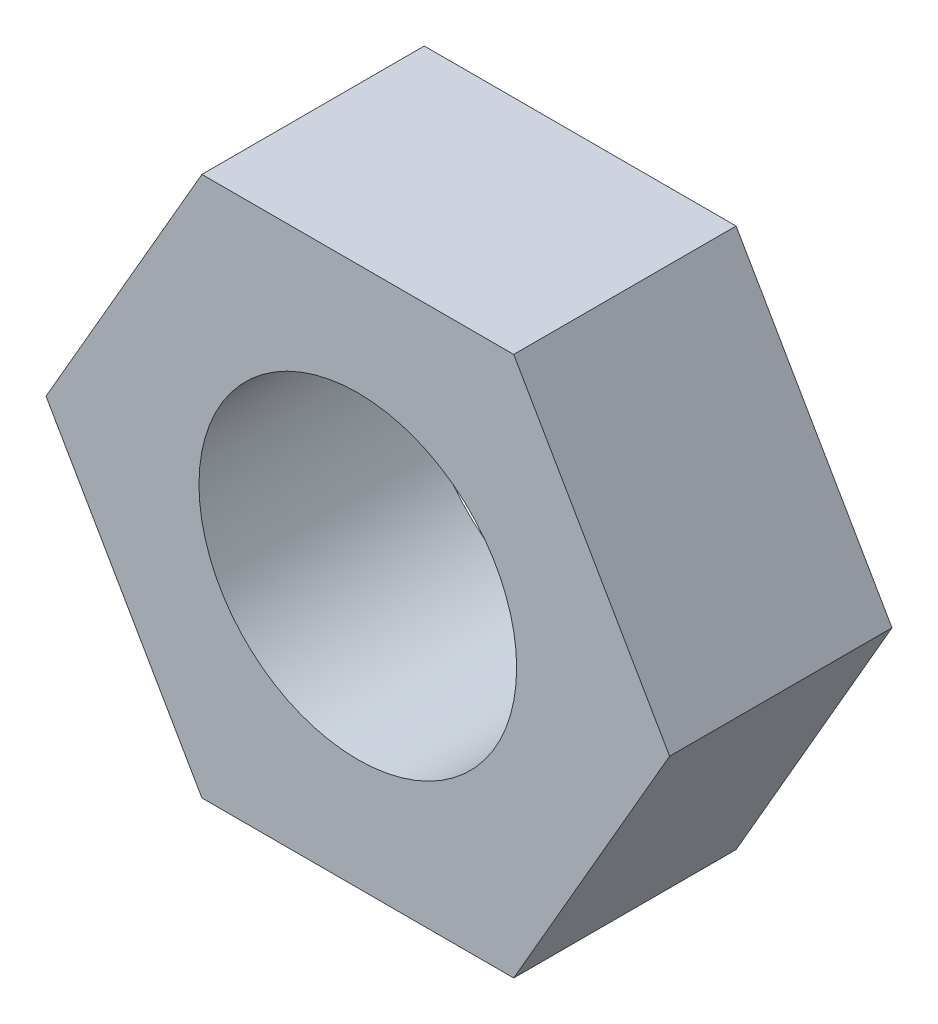
ISO-10303-21;
HEADER;
FILE_DESCRIPTION(('STEP AP214'),'2;1');
FILE_NAME('part.step','',(''),(''),'','','');
FILE_SCHEMA(('AUTOMOTIVE_DESIGN { 1 0 10303 214 1 1 1 1 }'));
ENDSEC;
DATA;
#1=APPLICATION_CONTEXT('core data for automotive mechanical design processes');
#2=APPLICATION_PROTOCOL_DEFINITION('international standard','automotive_design',2000,#1);
#3=PRODUCT_CONTEXT('',#1,'mechanical');
#4=PRODUCT('Part','Part','',(#3));
#5=PRODUCT_RELATED_PRODUCT_CATEGORY('part','',(#4));
#6=PRODUCT_DEFINITION_FORMATION('','',#4);
#7=PRODUCT_DEFINITION_CONTEXT('part definition',#1,'design');
#8=PRODUCT_DEFINITION('design','',#6,#7);
#9=PRODUCT_DEFINITION_SHAPE('','',#8);
#10=(LENGTH_UNIT() NAMED_UNIT(*) SI_UNIT(.MILLI.,.METRE.));
#11=(NAMED_UNIT(*) PLANE_ANGLE_UNIT() SI_UNIT($,.RADIAN.));
#12=(NAMED_UNIT(*) SI_UNIT($,.STERADIAN.) SOLID_ANGLE_UNIT());
#13=UNCERTAINTY_MEASURE_WITH_UNIT(LENGTH_MEASURE(1.E-05),#10,'distance_accuracy_value','');
#14=(GEOMETRIC_REPRESENTATION_CONTEXT(3) GLOBAL_UNCERTAINTY_ASSIGNED_CONTEXT((#13)) GLOBAL_UNIT_ASSIGNED_CONTEXT((#10,
#11,#12)) REPRESENTATION_CONTEXT('',''));
#15=CARTESIAN_POINT('',(0.,0.,0.));
#16=DIRECTION('',(0.,0.,1.));
#17=DIRECTION('',(1.,0.,0.));
#18=AXIS2_PLACEMENT_3D('',#15,#16,#17);
#19=CARTESIAN_POINT('',(0.,0.,7.));
#20=DIRECTION('',(0.,0.,1.));
#21=DIRECTION('',(1.,0.,0.));
#22=AXIS2_PLACEMENT_3D('',#19,#20,#21);
#23=PLANE('',#22);
#24=DIRECTION('',(0.499999999999995,0.866025403784441,0.));
#25=VECTOR('',#24,1.);
#26=CARTESIAN_POINT('',(4.90747728811192,-8.49999999999995,7.));
#27=LINE('',#26,#25);
#28=CARTESIAN_POINT('',(4.90747728811192,-8.49999999999995,7.));
#29=VERTEX_POINT('',#28);
#30=CARTESIAN_POINT('',(9.81495457622365,0.,7.));
#31=VERTEX_POINT('',#30);
#32=EDGE_CURVE('E133',#29,#31,#27,.T.);
#33=ORIENTED_EDGE('',*,*,#32,.T.);
#34=DIRECTION('',(-0.500000000000001,0.866025403784438,0.));
#35=VECTOR('',#34,1.);
#36=CARTESIAN_POINT('',(9.81495457622365,0.,7.));
#37=LINE('',#36,#35);
#38=CARTESIAN_POINT('',(4.9074772881118,8.50000000000002,7.));
#39=VERTEX_POINT('',#38);
#40=EDGE_CURVE('E91',#31,#39,#37,.T.);
#41=ORIENTED_EDGE('',*,*,#40,.T.);
#42=DIRECTION('',(-1.,0.,0.));
#43=VECTOR('',#42,1.);
#44=CARTESIAN_POINT('',(4.9074772881118,8.50000000000002,7.));
#45=LINE('',#44,#43);
#46=CARTESIAN_POINT('',(-4.90747728811186,8.49999999999999,7.));
#47=VERTEX_POINT('',#46);
#48=EDGE_CURVE('E104',#39,#47,#45,.T.);
#49=ORIENTED_EDGE('',*,*,#48,.T.);
#50=DIRECTION('',(-0.499999999999995,-0.866025403784442,0.));
#51=VECTOR('',#50,1.);
#52=CARTESIAN_POINT('',(-4.90747728811186,8.49999999999999,7.));
#53=LINE('',#52,#51);
#54=CARTESIAN_POINT('',(-9.81495457622364,0.,7.));
#55=VERTEX_POINT('',#54);
#56=EDGE_CURVE('E98',#47,#55,#53,.T.);
#57=ORIENTED_EDGE('',*,*,#56,.T.);
#58=DIRECTION('',(0.500000000000007,-0.866025403784435,0.));
#59=VECTOR('',#58,1.);
#60=CARTESIAN_POINT('',(-9.81495457622364,0.,7.));
#61=LINE('',#60,#59);
#62=CARTESIAN_POINT('',(-4.90747728811174,-8.50000000000005,7.));
#63=VERTEX_POINT('',#62);
#64=EDGE_CURVE('E102',#55,#63,#61,.T.);
#65=ORIENTED_EDGE('',*,*,#64,.T.);
#66=DIRECTION('',(1.,0.,0.));
#67=VECTOR('',#66,1.);
#68=CARTESIAN_POINT('',(-4.90747728811174,-8.50000000000005,7.));
#69=LINE('',#68,#67);
#70=EDGE_CURVE('E54',#63,#29,#69,.T.);
#71=ORIENTED_EDGE('',*,*,#70,.T.);
#72=EDGE_LOOP('',(#33,#41,#49,#57,#65,#71));
#73=FACE_BOUND('',#72,.T.);
#74=CARTESIAN_POINT('',(0.,0.,7.));
#75=DIRECTION('',(0.,0.,1.));
#76=DIRECTION('',(1.,0.,0.));
#77=AXIS2_PLACEMENT_3D('',#74,#75,#76);
#78=CIRCLE('',#77,5.);
#79=CARTESIAN_POINT('',(5.,0.,7.));
#80=VERTEX_POINT('',#79);
#81=EDGE_CURVE('E126',#80,#80,#78,.T.);
#82=ORIENTED_EDGE('',*,*,#81,.F.);
#83=EDGE_LOOP('',(#82));
#84=FACE_BOUND('',#83,.T.);
#85=ADVANCED_FACE('F37',(#73,#84),#23,.T.);
#86=CARTESIAN_POINT('',(0.,0.,0.));
#87=DIRECTION('',(0.,0.,1.));
#88=DIRECTION('',(1.,0.,0.));
#89=AXIS2_PLACEMENT_3D('',#86,#87,#88);
#90=PLANE('',#89);
#91=DIRECTION('',(0.499999999999995,0.866025403784441,0.));
#92=VECTOR('',#91,1.);
#93=CARTESIAN_POINT('',(4.90747728811192,-8.49999999999995,0.));
#94=LINE('',#93,#92);
#95=CARTESIAN_POINT('',(4.90747728811192,-8.49999999999995,0.));
#96=VERTEX_POINT('',#95);
#97=CARTESIAN_POINT('',(9.81495457622365,0.,0.));
#98=VERTEX_POINT('',#97);
#99=EDGE_CURVE('E122',#96,#98,#94,.T.);
#100=ORIENTED_EDGE('',*,*,#99,.F.);
#101=DIRECTION('',(1.,0.,0.));
#102=VECTOR('',#101,1.);
#103=CARTESIAN_POINT('',(-4.90747728811174,-8.50000000000005,0.));
#104=LINE('',#103,#102);
#105=CARTESIAN_POINT('',(-4.90747728811174,-8.50000000000005,0.));
#106=VERTEX_POINT('',#105);
#107=EDGE_CURVE('E83',#106,#96,#104,.T.);
#108=ORIENTED_EDGE('',*,*,#107,.F.);
#109=DIRECTION('',(0.500000000000007,-0.866025403784435,0.));
#110=VECTOR('',#109,1.);
#111=CARTESIAN_POINT('',(-9.81495457622364,0.,0.));
#112=LINE('',#111,#110);
#113=CARTESIAN_POINT('',(-9.81495457622364,0.,0.));
#114=VERTEX_POINT('',#113);
#115=EDGE_CURVE('E77',#114,#106,#112,.T.);
#116=ORIENTED_EDGE('',*,*,#115,.F.);
#117=DIRECTION('',(-0.499999999999995,-0.866025403784442,0.));
#118=VECTOR('',#117,1.);
#119=CARTESIAN_POINT('',(-4.90747728811186,8.49999999999999,0.));
#120=LINE('',#119,#118);
#121=CARTESIAN_POINT('',(-4.90747728811186,8.49999999999999,0.));
#122=VERTEX_POINT('',#121);
#123=EDGE_CURVE('E112',#122,#114,#120,.T.);
#124=ORIENTED_EDGE('',*,*,#123,.F.);
#125=DIRECTION('',(-1.,0.,0.));
#126=VECTOR('',#125,1.);
#127=CARTESIAN_POINT('',(4.9074772881118,8.50000000000002,0.));
#128=LINE('',#127,#126);
#129=CARTESIAN_POINT('',(4.9074772881118,8.50000000000002,0.));
#130=VERTEX_POINT('',#129);
#131=EDGE_CURVE('E128',#130,#122,#128,.T.);
#132=ORIENTED_EDGE('',*,*,#131,.F.);
#133=DIRECTION('',(-0.500000000000001,0.866025403784438,0.));
#134=VECTOR('',#133,1.);
#135=CARTESIAN_POINT('',(9.81495457622365,0.,0.));
#136=LINE('',#135,#134);
#137=EDGE_CURVE('E125',#98,#130,#136,.T.);
#138=ORIENTED_EDGE('',*,*,#137,.F.);
#139=EDGE_LOOP('',(#100,#108,#116,#124,#132,#138));
#140=FACE_BOUND('',#139,.T.);
#141=CARTESIAN_POINT('',(0.,0.,0.));
#142=DIRECTION('',(0.,0.,1.));
#143=DIRECTION('',(1.,0.,0.));
#144=AXIS2_PLACEMENT_3D('',#141,#142,#143);
#145=CIRCLE('',#144,5.);
#146=CARTESIAN_POINT('',(5.,0.,0.));
#147=VERTEX_POINT('',#146);
#148=EDGE_CURVE('E244',#147,#147,#145,.T.);
#149=ORIENTED_EDGE('',*,*,#148,.T.);
#150=EDGE_LOOP('',(#149));
#151=FACE_BOUND('',#150,.T.);
#152=ADVANCED_FACE('F142',(#140,#151),#90,.F.);
#153=CARTESIAN_POINT('',(4.90747728811192,-8.49999999999995,7.));
#154=DIRECTION('',(-0.866025403784441,0.499999999999995,0.));
#155=DIRECTION('',(-0.499999999999995,-0.866025403784441,0.));
#156=AXIS2_PLACEMENT_3D('',#153,#154,#155);
#157=PLANE('',#156);
#158=ORIENTED_EDGE('',*,*,#99,.T.);
#159=DIRECTION('',(0.,0.,-1.));
#160=VECTOR('',#159,1.);
#161=CARTESIAN_POINT('',(9.81495457622365,0.,7.));
#162=LINE('',#161,#160);
#163=EDGE_CURVE('E11',#31,#98,#162,.T.);
#164=ORIENTED_EDGE('',*,*,#163,.F.);
#165=ORIENTED_EDGE('',*,*,#32,.F.);
#166=DIRECTION('',(0.,0.,-1.));
#167=VECTOR('',#166,1.);
#168=CARTESIAN_POINT('',(4.90747728811192,-8.49999999999995,7.));
#169=LINE('',#168,#167);
#170=EDGE_CURVE('E118',#29,#96,#169,.T.);
#171=ORIENTED_EDGE('',*,*,#170,.T.);
#172=EDGE_LOOP('',(#158,#164,#165,#171));
#173=FACE_BOUND('',#172,.T.);
#174=ADVANCED_FACE('F39',(#173),#157,.F.);
#175=CARTESIAN_POINT('',(9.81495457622365,0.,7.));
#176=DIRECTION('',(-0.866025403784438,-0.500000000000001,0.));
#177=DIRECTION('',(0.500000000000001,-0.866025403784438,0.));
#178=AXIS2_PLACEMENT_3D('',#175,#176,#177);
#179=PLANE('',#178);
#180=ORIENTED_EDGE('',*,*,#137,.T.);
#181=DIRECTION('',(0.,0.,-1.));
#182=VECTOR('',#181,1.);
#183=CARTESIAN_POINT('',(4.9074772881118,8.50000000000002,7.));
#184=LINE('',#183,#182);
#185=EDGE_CURVE('E46',#39,#130,#184,.T.);
#186=ORIENTED_EDGE('',*,*,#185,.F.);
#187=ORIENTED_EDGE('',*,*,#40,.F.);
#188=ORIENTED_EDGE('',*,*,#163,.T.);
#189=EDGE_LOOP('',(#180,#186,#187,#188));
#190=FACE_BOUND('',#189,.T.);
#191=ADVANCED_FACE('F167',(#190),#179,.F.);
#192=CARTESIAN_POINT('',(4.9074772881118,8.50000000000002,7.));
#193=DIRECTION('',(0.,-1.,0.));
#194=DIRECTION('',(1.,0.,0.));
#195=AXIS2_PLACEMENT_3D('',#192,#193,#194);
#196=PLANE('',#195);
#197=ORIENTED_EDGE('',*,*,#131,.T.);
#198=DIRECTION('',(0.,0.,-1.));
#199=VECTOR('',#198,1.);
#200=CARTESIAN_POINT('',(-4.90747728811186,8.49999999999999,7.));
#201=LINE('',#200,#199);
#202=EDGE_CURVE('E113',#47,#122,#201,.T.);
#203=ORIENTED_EDGE('',*,*,#202,.F.);
#204=ORIENTED_EDGE('',*,*,#48,.F.);
#205=ORIENTED_EDGE('',*,*,#185,.T.);
#206=EDGE_LOOP('',(#197,#203,#204,#205));
#207=FACE_BOUND('',#206,.T.);
#208=ADVANCED_FACE('F139',(#207),#196,.F.);
#209=CARTESIAN_POINT('',(-4.90747728811186,8.49999999999999,7.));
#210=DIRECTION('',(0.866025403784442,-0.499999999999995,0.));
#211=DIRECTION('',(0.499999999999995,0.866025403784442,0.));
#212=AXIS2_PLACEMENT_3D('',#209,#210,#211);
#213=PLANE('',#212);
#214=ORIENTED_EDGE('',*,*,#123,.T.);
#215=DIRECTION('',(0.,0.,-1.));
#216=VECTOR('',#215,1.);
#217=CARTESIAN_POINT('',(-9.81495457622364,0.,7.));
#218=LINE('',#217,#216);
#219=EDGE_CURVE('E109',#55,#114,#218,.T.);
#220=ORIENTED_EDGE('',*,*,#219,.F.);
#221=ORIENTED_EDGE('',*,*,#56,.F.);
#222=ORIENTED_EDGE('',*,*,#202,.T.);
#223=EDGE_LOOP('',(#214,#220,#221,#222));
#224=FACE_BOUND('',#223,.T.);
#225=ADVANCED_FACE('F110',(#224),#213,.F.);
#226=CARTESIAN_POINT('',(-9.81495457622364,0.,7.));
#227=DIRECTION('',(0.866025403784435,0.500000000000007,0.));
#228=DIRECTION('',(-0.500000000000007,0.866025403784435,0.));
#229=AXIS2_PLACEMENT_3D('',#226,#227,#228);
#230=PLANE('',#229);
#231=ORIENTED_EDGE('',*,*,#115,.T.);
#232=DIRECTION('',(0.,0.,-1.));
#233=VECTOR('',#232,1.);
#234=CARTESIAN_POINT('',(-4.90747728811174,-8.50000000000005,7.));
#235=LINE('',#234,#233);
#236=EDGE_CURVE('E114',#63,#106,#235,.T.);
#237=ORIENTED_EDGE('',*,*,#236,.F.);
#238=ORIENTED_EDGE('',*,*,#64,.F.);
#239=ORIENTED_EDGE('',*,*,#219,.T.);
#240=EDGE_LOOP('',(#231,#237,#238,#239));
#241=FACE_BOUND('',#240,.T.);
#242=ADVANCED_FACE('F116',(#241),#230,.F.);
#243=CARTESIAN_POINT('',(-4.90747728811174,-8.50000000000005,7.));
#244=DIRECTION('',(0.,1.,0.));
#245=DIRECTION('',(-1.,0.,0.));
#246=AXIS2_PLACEMENT_3D('',#243,#244,#245);
#247=PLANE('',#246);
#248=ORIENTED_EDGE('',*,*,#107,.T.);
#249=ORIENTED_EDGE('',*,*,#170,.F.);
#250=ORIENTED_EDGE('',*,*,#70,.F.);
#251=ORIENTED_EDGE('',*,*,#236,.T.);
#252=EDGE_LOOP('',(#248,#249,#250,#251));
#253=FACE_BOUND('',#252,.T.);
#254=ADVANCED_FACE('F147',(#253),#247,.F.);
#255=CARTESIAN_POINT('',(0.,0.,7.));
#256=DIRECTION('',(0.,0.,-1.));
#257=DIRECTION('',(-1.,0.,0.));
#258=AXIS2_PLACEMENT_3D('',#255,#256,#257);
#259=CYLINDRICAL_SURFACE('',#258,5.);
#260=ORIENTED_EDGE('',*,*,#81,.T.);
#261=EDGE_LOOP('',(#260));
#262=FACE_BOUND('',#261,.T.);
#263=ORIENTED_EDGE('',*,*,#148,.F.);
#264=EDGE_LOOP('',(#263));
#265=FACE_BOUND('',#264,.T.);
#266=ADVANCED_FACE('F149',(#262,#265),#259,.F.);
#267=CLOSED_SHELL('',(#85,#152,#174,#191,#208,#225,#242,#254,#266));
#268=MANIFOLD_SOLID_BREP('B2',#267);
#269=ADVANCED_BREP_SHAPE_REPRESENTATION('',(#18,#268),#14);
#270=SHAPE_DEFINITION_REPRESENTATION(#9,#269);
ENDSEC;
END-ISO-10303-21;
